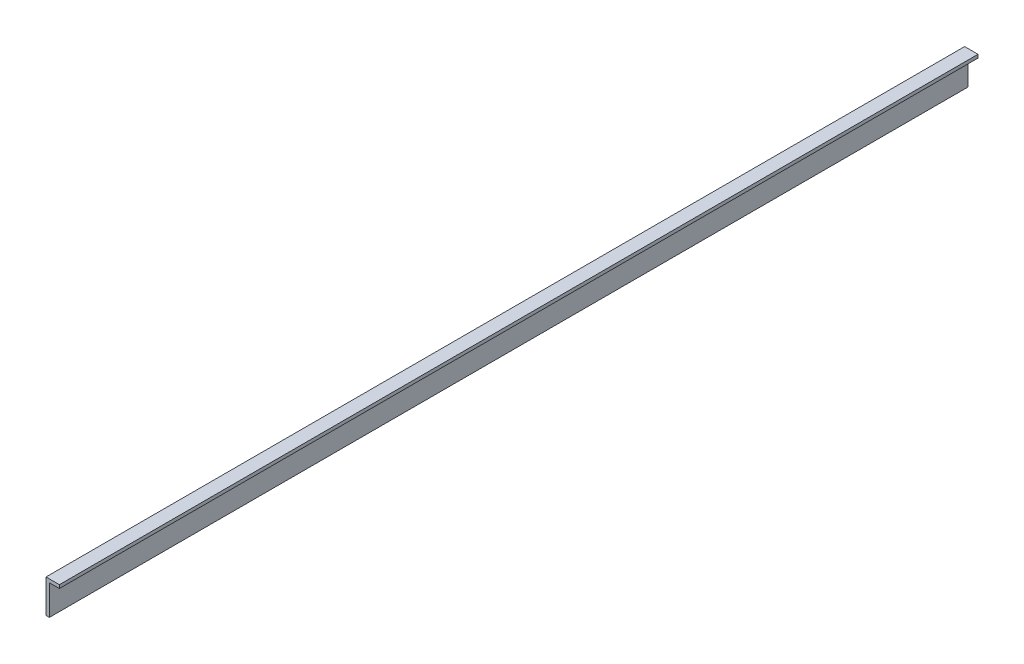
ISO-10303-21;
HEADER;
FILE_DESCRIPTION(('STEP AP214'),'2;1');
FILE_NAME('part.step','',(''),(''),'','','');
FILE_SCHEMA(('AUTOMOTIVE_DESIGN { 1 0 10303 214 1 1 1 1 }'));
ENDSEC;
DATA;
#1=APPLICATION_CONTEXT('core data for automotive mechanical design processes');
#2=APPLICATION_PROTOCOL_DEFINITION('international standard','automotive_design',2000,#1);
#3=PRODUCT_CONTEXT('',#1,'mechanical');
#4=PRODUCT('Part','Part','',(#3));
#5=PRODUCT_RELATED_PRODUCT_CATEGORY('part','',(#4));
#6=PRODUCT_DEFINITION_FORMATION('','',#4);
#7=PRODUCT_DEFINITION_CONTEXT('part definition',#1,'design');
#8=PRODUCT_DEFINITION('design','',#6,#7);
#9=PRODUCT_DEFINITION_SHAPE('','',#8);
#10=(LENGTH_UNIT() NAMED_UNIT(*) SI_UNIT(.MILLI.,.METRE.));
#11=(NAMED_UNIT(*) PLANE_ANGLE_UNIT() SI_UNIT($,.RADIAN.));
#12=(NAMED_UNIT(*) SI_UNIT($,.STERADIAN.) SOLID_ANGLE_UNIT());
#13=UNCERTAINTY_MEASURE_WITH_UNIT(LENGTH_MEASURE(1.E-05),#10,'distance_accuracy_value','');
#14=(GEOMETRIC_REPRESENTATION_CONTEXT(3) GLOBAL_UNCERTAINTY_ASSIGNED_CONTEXT((#13)) GLOBAL_UNIT_ASSIGNED_CONTEXT((#10,
#11,#12)) REPRESENTATION_CONTEXT('',''));
#15=CARTESIAN_POINT('',(0.,0.,0.));
#16=DIRECTION('',(0.,0.,1.));
#17=DIRECTION('',(1.,0.,0.));
#18=AXIS2_PLACEMENT_3D('',#15,#16,#17);
#19=CARTESIAN_POINT('',(56.,888.,-580.));
#20=DIRECTION('',(1.,0.,0.));
#21=DIRECTION('',(0.,0.,-1.));
#22=AXIS2_PLACEMENT_3D('',#19,#20,#21);
#23=PLANE('',#22);
#24=DIRECTION('',(0.,1.,0.));
#25=VECTOR('',#24,1.);
#26=CARTESIAN_POINT('',(56.,888.,-30.));
#27=LINE('',#26,#25);
#28=CARTESIAN_POINT('',(56.,870.,-30.));
#29=VERTEX_POINT('',#28);
#30=CARTESIAN_POINT('',(56.,888.,-30.));
#31=VERTEX_POINT('',#30);
#32=EDGE_CURVE('E124',#29,#31,#27,.T.);
#33=ORIENTED_EDGE('',*,*,#32,.F.);
#34=DIRECTION('',(0.,0.,1.));
#35=VECTOR('',#34,1.);
#36=CARTESIAN_POINT('',(56.,870.,-580.));
#37=LINE('',#36,#35);
#38=CARTESIAN_POINT('',(56.,870.,-580.));
#39=VERTEX_POINT('',#38);
#40=EDGE_CURVE('E11',#39,#29,#37,.T.);
#41=ORIENTED_EDGE('',*,*,#40,.F.);
#42=DIRECTION('',(0.,1.,0.));
#43=VECTOR('',#42,1.);
#44=CARTESIAN_POINT('',(56.,888.,-580.));
#45=LINE('',#44,#43);
#46=CARTESIAN_POINT('',(56.,888.,-580.));
#47=VERTEX_POINT('',#46);
#48=EDGE_CURVE('E138',#39,#47,#45,.T.);
#49=ORIENTED_EDGE('',*,*,#48,.T.);
#50=DIRECTION('',(0.,0.,1.));
#51=VECTOR('',#50,1.);
#52=CARTESIAN_POINT('',(56.,888.,-580.));
#53=LINE('',#52,#51);
#54=EDGE_CURVE('E42',#47,#31,#53,.T.);
#55=ORIENTED_EDGE('',*,*,#54,.T.);
#56=EDGE_LOOP('',(#33,#41,#49,#55));
#57=FACE_BOUND('',#56,.T.);
#58=ADVANCED_FACE('F39',(#57),#23,.T.);
#59=CARTESIAN_POINT('',(56.,870.,-580.));
#60=DIRECTION('',(0.,-1.,0.));
#61=DIRECTION('',(0.,0.,-1.));
#62=AXIS2_PLACEMENT_3D('',#59,#60,#61);
#63=PLANE('',#62);
#64=DIRECTION('',(1.,0.,0.));
#65=VECTOR('',#64,1.);
#66=CARTESIAN_POINT('',(56.,870.,-30.));
#67=LINE('',#66,#65);
#68=CARTESIAN_POINT('',(54.,870.,-30.));
#69=VERTEX_POINT('',#68);
#70=EDGE_CURVE('E136',#69,#29,#67,.T.);
#71=ORIENTED_EDGE('',*,*,#70,.F.);
#72=DIRECTION('',(0.,0.,1.));
#73=VECTOR('',#72,1.);
#74=CARTESIAN_POINT('',(54.,870.,-580.));
#75=LINE('',#74,#73);
#76=CARTESIAN_POINT('',(54.,870.,-580.));
#77=VERTEX_POINT('',#76);
#78=EDGE_CURVE('E48',#77,#69,#75,.T.);
#79=ORIENTED_EDGE('',*,*,#78,.F.);
#80=DIRECTION('',(1.,0.,0.));
#81=VECTOR('',#80,1.);
#82=CARTESIAN_POINT('',(56.,870.,-580.));
#83=LINE('',#82,#81);
#84=EDGE_CURVE('E114',#77,#39,#83,.T.);
#85=ORIENTED_EDGE('',*,*,#84,.T.);
#86=ORIENTED_EDGE('',*,*,#40,.T.);
#87=EDGE_LOOP('',(#71,#79,#85,#86));
#88=FACE_BOUND('',#87,.T.);
#89=ADVANCED_FACE('F146',(#88),#63,.T.);
#90=CARTESIAN_POINT('',(54.,870.,-580.));
#91=DIRECTION('',(-1.,0.,0.));
#92=DIRECTION('',(0.,0.,1.));
#93=AXIS2_PLACEMENT_3D('',#90,#91,#92);
#94=PLANE('',#93);
#95=DIRECTION('',(0.,-1.,0.));
#96=VECTOR('',#95,1.);
#97=CARTESIAN_POINT('',(54.,870.,-30.));
#98=LINE('',#97,#96);
#99=CARTESIAN_POINT('',(54.,890.,-30.));
#100=VERTEX_POINT('',#99);
#101=EDGE_CURVE('E101',#100,#69,#98,.T.);
#102=ORIENTED_EDGE('',*,*,#101,.F.);
#103=DIRECTION('',(0.,0.,1.));
#104=VECTOR('',#103,1.);
#105=CARTESIAN_POINT('',(54.,890.,-580.));
#106=LINE('',#105,#104);
#107=CARTESIAN_POINT('',(54.,890.,-580.));
#108=VERTEX_POINT('',#107);
#109=EDGE_CURVE('E96',#108,#100,#106,.T.);
#110=ORIENTED_EDGE('',*,*,#109,.F.);
#111=DIRECTION('',(0.,-1.,0.));
#112=VECTOR('',#111,1.);
#113=CARTESIAN_POINT('',(54.,870.,-580.));
#114=LINE('',#113,#112);
#115=EDGE_CURVE('E99',#108,#77,#114,.T.);
#116=ORIENTED_EDGE('',*,*,#115,.T.);
#117=ORIENTED_EDGE('',*,*,#78,.T.);
#118=EDGE_LOOP('',(#102,#110,#116,#117));
#119=FACE_BOUND('',#118,.T.);
#120=ADVANCED_FACE('F98',(#119),#94,.T.);
#121=CARTESIAN_POINT('',(54.,890.,-580.));
#122=DIRECTION('',(0.,1.,0.));
#123=DIRECTION('',(0.,0.,1.));
#124=AXIS2_PLACEMENT_3D('',#121,#122,#123);
#125=PLANE('',#124);
#126=DIRECTION('',(-1.,0.,0.));
#127=VECTOR('',#126,1.);
#128=CARTESIAN_POINT('',(54.,890.,-30.));
#129=LINE('',#128,#127);
#130=CARTESIAN_POINT('',(62.,890.,-30.));
#131=VERTEX_POINT('',#130);
#132=EDGE_CURVE('E133',#131,#100,#129,.T.);
#133=ORIENTED_EDGE('',*,*,#132,.F.);
#134=DIRECTION('',(0.,0.,1.));
#135=VECTOR('',#134,1.);
#136=CARTESIAN_POINT('',(62.,890.,-580.));
#137=LINE('',#136,#135);
#138=CARTESIAN_POINT('',(62.,890.,-580.));
#139=VERTEX_POINT('',#138);
#140=EDGE_CURVE('E106',#139,#131,#137,.T.);
#141=ORIENTED_EDGE('',*,*,#140,.F.);
#142=DIRECTION('',(-1.,0.,0.));
#143=VECTOR('',#142,1.);
#144=CARTESIAN_POINT('',(54.,890.,-580.));
#145=LINE('',#144,#143);
#146=EDGE_CURVE('E112',#139,#108,#145,.T.);
#147=ORIENTED_EDGE('',*,*,#146,.T.);
#148=ORIENTED_EDGE('',*,*,#109,.T.);
#149=EDGE_LOOP('',(#133,#141,#147,#148));
#150=FACE_BOUND('',#149,.T.);
#151=ADVANCED_FACE('F116',(#150),#125,.T.);
#152=CARTESIAN_POINT('',(62.,890.,-580.));
#153=DIRECTION('',(1.,0.,0.));
#154=DIRECTION('',(0.,0.,-1.));
#155=AXIS2_PLACEMENT_3D('',#152,#153,#154);
#156=PLANE('',#155);
#157=DIRECTION('',(0.,1.,0.));
#158=VECTOR('',#157,1.);
#159=CARTESIAN_POINT('',(62.,890.,-30.));
#160=LINE('',#159,#158);
#161=CARTESIAN_POINT('',(62.,888.,-30.));
#162=VERTEX_POINT('',#161);
#163=EDGE_CURVE('E130',#162,#131,#160,.T.);
#164=ORIENTED_EDGE('',*,*,#163,.F.);
#165=DIRECTION('',(0.,0.,1.));
#166=VECTOR('',#165,1.);
#167=CARTESIAN_POINT('',(62.,888.,-580.));
#168=LINE('',#167,#166);
#169=CARTESIAN_POINT('',(62.,888.,-580.));
#170=VERTEX_POINT('',#169);
#171=EDGE_CURVE('E141',#170,#162,#168,.T.);
#172=ORIENTED_EDGE('',*,*,#171,.F.);
#173=DIRECTION('',(0.,1.,0.));
#174=VECTOR('',#173,1.);
#175=CARTESIAN_POINT('',(62.,890.,-580.));
#176=LINE('',#175,#174);
#177=EDGE_CURVE('E117',#170,#139,#176,.T.);
#178=ORIENTED_EDGE('',*,*,#177,.T.);
#179=ORIENTED_EDGE('',*,*,#140,.T.);
#180=EDGE_LOOP('',(#164,#172,#178,#179));
#181=FACE_BOUND('',#180,.T.);
#182=ADVANCED_FACE('F159',(#181),#156,.T.);
#183=CARTESIAN_POINT('',(62.,888.,-580.));
#184=DIRECTION('',(0.,-1.,0.));
#185=DIRECTION('',(0.,0.,-1.));
#186=AXIS2_PLACEMENT_3D('',#183,#184,#185);
#187=PLANE('',#186);
#188=DIRECTION('',(1.,0.,0.));
#189=VECTOR('',#188,1.);
#190=CARTESIAN_POINT('',(62.,888.,-30.));
#191=LINE('',#190,#189);
#192=EDGE_CURVE('E127',#31,#162,#191,.T.);
#193=ORIENTED_EDGE('',*,*,#192,.F.);
#194=ORIENTED_EDGE('',*,*,#54,.F.);
#195=DIRECTION('',(1.,0.,0.));
#196=VECTOR('',#195,1.);
#197=CARTESIAN_POINT('',(62.,888.,-580.));
#198=LINE('',#197,#196);
#199=EDGE_CURVE('E119',#47,#170,#198,.T.);
#200=ORIENTED_EDGE('',*,*,#199,.T.);
#201=ORIENTED_EDGE('',*,*,#171,.T.);
#202=EDGE_LOOP('',(#193,#194,#200,#201));
#203=FACE_BOUND('',#202,.T.);
#204=ADVANCED_FACE('F143',(#203),#187,.T.);
#205=CARTESIAN_POINT('',(0.,0.,-580.));
#206=DIRECTION('',(0.,0.,-1.));
#207=DIRECTION('',(-1.,0.,0.));
#208=AXIS2_PLACEMENT_3D('',#205,#206,#207);
#209=PLANE('',#208);
#210=ORIENTED_EDGE('',*,*,#48,.F.);
#211=ORIENTED_EDGE('',*,*,#84,.F.);
#212=ORIENTED_EDGE('',*,*,#115,.F.);
#213=ORIENTED_EDGE('',*,*,#146,.F.);
#214=ORIENTED_EDGE('',*,*,#177,.F.);
#215=ORIENTED_EDGE('',*,*,#199,.F.);
#216=EDGE_LOOP('',(#210,#211,#212,#213,#214,#215));
#217=FACE_BOUND('',#216,.T.);
#218=ADVANCED_FACE('F110',(#217),#209,.T.);
#219=CARTESIAN_POINT('',(0.,0.,-30.));
#220=DIRECTION('',(0.,0.,-1.));
#221=DIRECTION('',(-1.,0.,0.));
#222=AXIS2_PLACEMENT_3D('',#219,#220,#221);
#223=PLANE('',#222);
#224=ORIENTED_EDGE('',*,*,#32,.T.);
#225=ORIENTED_EDGE('',*,*,#192,.T.);
#226=ORIENTED_EDGE('',*,*,#163,.T.);
#227=ORIENTED_EDGE('',*,*,#132,.T.);
#228=ORIENTED_EDGE('',*,*,#101,.T.);
#229=ORIENTED_EDGE('',*,*,#70,.T.);
#230=EDGE_LOOP('',(#224,#225,#226,#227,#228,#229));
#231=FACE_BOUND('',#230,.T.);
#232=ADVANCED_FACE('F145',(#231),#223,.F.);
#233=CLOSED_SHELL('',(#58,#89,#120,#151,#182,#204,#218,#232));
#234=MANIFOLD_SOLID_BREP('B2',#233);
#235=ADVANCED_BREP_SHAPE_REPRESENTATION('',(#18,#234),#14);
#236=SHAPE_DEFINITION_REPRESENTATION(#9,#235);
ENDSEC;
END-ISO-10303-21;
